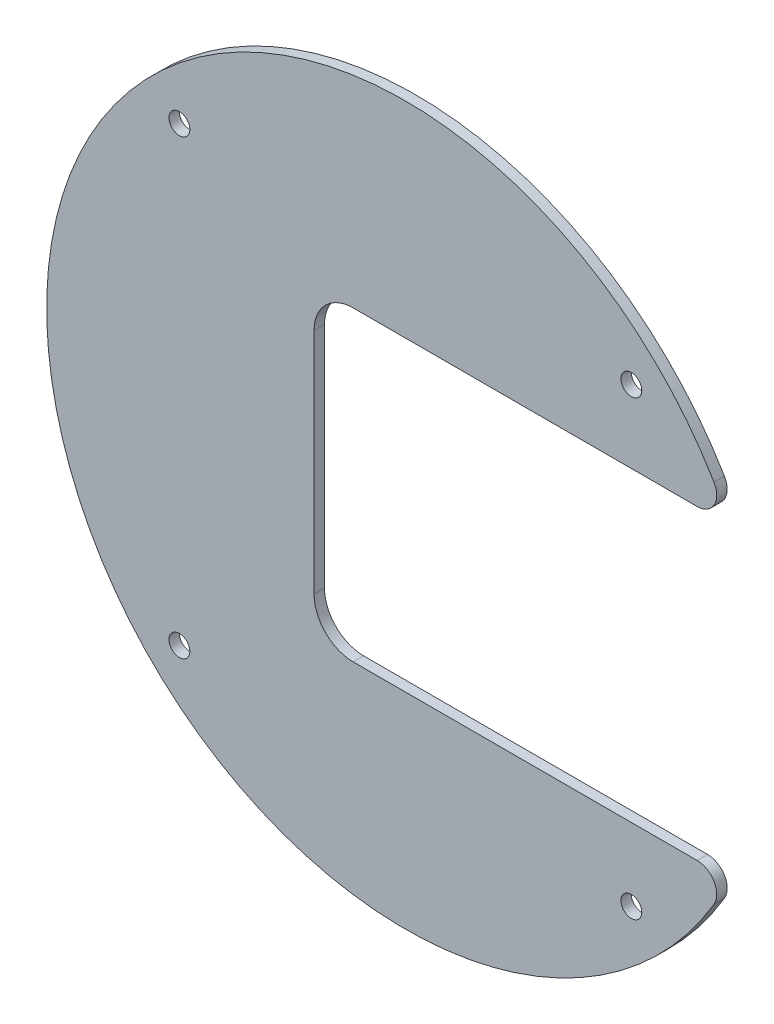
ISO-10303-21;
HEADER;
FILE_DESCRIPTION(('STEP AP214'),'2;1');
FILE_NAME('part.step','',(''),(''),'','','');
FILE_SCHEMA(('AUTOMOTIVE_DESIGN { 1 0 10303 214 1 1 1 1 }'));
ENDSEC;
DATA;
#1=APPLICATION_CONTEXT('core data for automotive mechanical design processes');
#2=APPLICATION_PROTOCOL_DEFINITION('international standard','automotive_design',2000,#1);
#3=PRODUCT_CONTEXT('',#1,'mechanical');
#4=PRODUCT('Part','Part','',(#3));
#5=PRODUCT_RELATED_PRODUCT_CATEGORY('part','',(#4));
#6=PRODUCT_DEFINITION_FORMATION('','',#4);
#7=PRODUCT_DEFINITION_CONTEXT('part definition',#1,'design');
#8=PRODUCT_DEFINITION('design','',#6,#7);
#9=PRODUCT_DEFINITION_SHAPE('','',#8);
#10=(LENGTH_UNIT() NAMED_UNIT(*) SI_UNIT(.MILLI.,.METRE.));
#11=(NAMED_UNIT(*) PLANE_ANGLE_UNIT() SI_UNIT($,.RADIAN.));
#12=(NAMED_UNIT(*) SI_UNIT($,.STERADIAN.) SOLID_ANGLE_UNIT());
#13=UNCERTAINTY_MEASURE_WITH_UNIT(LENGTH_MEASURE(1.E-05),#10,'distance_accuracy_value','');
#14=(GEOMETRIC_REPRESENTATION_CONTEXT(3) GLOBAL_UNCERTAINTY_ASSIGNED_CONTEXT((#13)) GLOBAL_UNIT_ASSIGNED_CONTEXT((#10,
#11,#12)) REPRESENTATION_CONTEXT('',''));
#15=CARTESIAN_POINT('',(0.,0.,0.));
#16=DIRECTION('',(0.,0.,1.));
#17=DIRECTION('',(1.,0.,0.));
#18=AXIS2_PLACEMENT_3D('',#15,#16,#17);
#19=CARTESIAN_POINT('',(0.,0.,1.6));
#20=DIRECTION('',(0.,0.,1.));
#21=DIRECTION('',(1.,0.,0.));
#22=AXIS2_PLACEMENT_3D('',#19,#20,#21);
#23=PLANE('',#22);
#24=CARTESIAN_POINT('',(-34.6482322781408,-34.6482322781408,1.6));
#25=DIRECTION('',(0.,0.,1.));
#26=DIRECTION('',(1.,0.,0.));
#27=AXIS2_PLACEMENT_3D('',#24,#25,#26);
#28=CIRCLE('',#27,1.6);
#29=CARTESIAN_POINT('',(-33.0482322781408,-34.6482322781408,1.6));
#30=VERTEX_POINT('',#29);
#31=EDGE_CURVE('E230',#30,#30,#28,.T.);
#32=ORIENTED_EDGE('',*,*,#31,.F.);
#33=EDGE_LOOP('',(#32));
#34=FACE_BOUND('',#33,.T.);
#35=CARTESIAN_POINT('',(34.6482322781408,34.6482322781408,1.6));
#36=DIRECTION('',(0.,0.,1.));
#37=DIRECTION('',(1.,0.,0.));
#38=AXIS2_PLACEMENT_3D('',#35,#36,#37);
#39=CIRCLE('',#38,1.6);
#40=CARTESIAN_POINT('',(36.2482322781408,34.6482322781408,1.6));
#41=VERTEX_POINT('',#40);
#42=EDGE_CURVE('E239',#41,#41,#39,.T.);
#43=ORIENTED_EDGE('',*,*,#42,.F.);
#44=EDGE_LOOP('',(#43));
#45=FACE_BOUND('',#44,.T.);
#46=DIRECTION('',(1.,0.,0.));
#47=VECTOR('',#46,1.);
#48=CARTESIAN_POINT('',(-14.,23.5,1.6));
#49=LINE('',#48,#47);
#50=CARTESIAN_POINT('',(-8.,23.5,1.6));
#51=VERTEX_POINT('',#50);
#52=CARTESIAN_POINT('',(44.7409208666965,23.5,1.6));
#53=VERTEX_POINT('',#52);
#54=EDGE_CURVE('E120',#51,#53,#49,.T.);
#55=ORIENTED_EDGE('',*,*,#54,.T.);
#56=CARTESIAN_POINT('',(44.7409208666965,26.5,1.6));
#57=DIRECTION('',(0.,0.,1.));
#58=DIRECTION('',(1.,0.,0.));
#59=AXIS2_PLACEMENT_3D('',#56,#57,#58);
#60=CIRCLE('',#59,3.);
#61=CARTESIAN_POINT('',(47.3221278397752,28.0288461538462,1.6));
#62=VERTEX_POINT('',#61);
#63=EDGE_CURVE('E45',#53,#62,#60,.T.);
#64=ORIENTED_EDGE('',*,*,#63,.T.);
#65=CARTESIAN_POINT('',(0.,0.,1.6));
#66=DIRECTION('',(0.,0.,1.));
#67=DIRECTION('',(1.,0.,0.));
#68=AXIS2_PLACEMENT_3D('',#65,#66,#67);
#69=CIRCLE('',#68,55.);
#70=CARTESIAN_POINT('',(47.3221278397752,-28.0288461538462,1.6));
#71=VERTEX_POINT('',#70);
#72=EDGE_CURVE('E127',#62,#71,#69,.T.);
#73=ORIENTED_EDGE('',*,*,#72,.T.);
#74=CARTESIAN_POINT('',(44.7409208666965,-26.5,1.6));
#75=DIRECTION('',(0.,0.,1.));
#76=DIRECTION('',(1.,0.,0.));
#77=AXIS2_PLACEMENT_3D('',#74,#75,#76);
#78=CIRCLE('',#77,3.);
#79=CARTESIAN_POINT('',(44.7409208666965,-23.5,1.6));
#80=VERTEX_POINT('',#79);
#81=EDGE_CURVE('E52',#71,#80,#78,.T.);
#82=ORIENTED_EDGE('',*,*,#81,.T.);
#83=DIRECTION('',(-1.,0.,0.));
#84=VECTOR('',#83,1.);
#85=CARTESIAN_POINT('',(49.7267533627523,-23.5,1.6));
#86=LINE('',#85,#84);
#87=CARTESIAN_POINT('',(-8.,-23.5,1.6));
#88=VERTEX_POINT('',#87);
#89=EDGE_CURVE('E130',#80,#88,#86,.T.);
#90=ORIENTED_EDGE('',*,*,#89,.T.);
#91=CARTESIAN_POINT('',(-8.,-17.5,1.6));
#92=DIRECTION('',(0.,0.,1.));
#93=DIRECTION('',(1.,0.,0.));
#94=AXIS2_PLACEMENT_3D('',#91,#92,#93);
#95=CIRCLE('',#94,6.);
#96=CARTESIAN_POINT('',(-14.,-17.5,1.6));
#97=VERTEX_POINT('',#96);
#98=EDGE_CURVE('E145',#88,#97,#95,.F.);
#99=ORIENTED_EDGE('',*,*,#98,.T.);
#100=DIRECTION('',(0.,1.,0.));
#101=VECTOR('',#100,1.);
#102=CARTESIAN_POINT('',(-14.,-23.5,1.6));
#103=LINE('',#102,#101);
#104=CARTESIAN_POINT('',(-14.,17.5,1.6));
#105=VERTEX_POINT('',#104);
#106=EDGE_CURVE('E246',#97,#105,#103,.T.);
#107=ORIENTED_EDGE('',*,*,#106,.T.);
#108=CARTESIAN_POINT('',(-8.,17.5,1.6));
#109=DIRECTION('',(0.,0.,1.));
#110=DIRECTION('',(1.,0.,0.));
#111=AXIS2_PLACEMENT_3D('',#108,#109,#110);
#112=CIRCLE('',#111,6.);
#113=EDGE_CURVE('E115',#105,#51,#112,.F.);
#114=ORIENTED_EDGE('',*,*,#113,.T.);
#115=EDGE_LOOP('',(#55,#64,#73,#82,#90,#99,#107,#114));
#116=FACE_BOUND('',#115,.T.);
#117=CARTESIAN_POINT('',(-34.6482322781408,34.6482322781408,1.6));
#118=DIRECTION('',(0.,0.,1.));
#119=DIRECTION('',(1.,0.,0.));
#120=AXIS2_PLACEMENT_3D('',#117,#118,#119);
#121=CIRCLE('',#120,1.6);
#122=CARTESIAN_POINT('',(-33.0482322781408,34.6482322781408,1.6));
#123=VERTEX_POINT('',#122);
#124=EDGE_CURVE('E225',#123,#123,#121,.T.);
#125=ORIENTED_EDGE('',*,*,#124,.F.);
#126=EDGE_LOOP('',(#125));
#127=FACE_BOUND('',#126,.T.);
#128=CARTESIAN_POINT('',(34.6482322781408,-34.6482322781408,1.6));
#129=DIRECTION('',(0.,0.,1.));
#130=DIRECTION('',(1.,0.,0.));
#131=AXIS2_PLACEMENT_3D('',#128,#129,#130);
#132=CIRCLE('',#131,1.6);
#133=CARTESIAN_POINT('',(36.2482322781408,-34.6482322781408,1.6));
#134=VERTEX_POINT('',#133);
#135=EDGE_CURVE('E265',#134,#134,#132,.T.);
#136=ORIENTED_EDGE('',*,*,#135,.F.);
#137=EDGE_LOOP('',(#136));
#138=FACE_BOUND('',#137,.T.);
#139=ADVANCED_FACE('F37',(#34,#45,#116,#127,#138),#23,.T.);
#140=CARTESIAN_POINT('',(0.,0.,0.));
#141=DIRECTION('',(0.,0.,1.));
#142=DIRECTION('',(1.,0.,0.));
#143=AXIS2_PLACEMENT_3D('',#140,#141,#142);
#144=PLANE('',#143);
#145=CARTESIAN_POINT('',(0.,0.,0.));
#146=DIRECTION('',(0.,0.,1.));
#147=DIRECTION('',(1.,0.,0.));
#148=AXIS2_PLACEMENT_3D('',#145,#146,#147);
#149=CIRCLE('',#148,55.);
#150=CARTESIAN_POINT('',(47.3221278397752,28.0288461538462,0.));
#151=VERTEX_POINT('',#150);
#152=CARTESIAN_POINT('',(47.3221278397752,-28.0288461538462,0.));
#153=VERTEX_POINT('',#152);
#154=EDGE_CURVE('E242',#151,#153,#149,.T.);
#155=ORIENTED_EDGE('',*,*,#154,.F.);
#156=CARTESIAN_POINT('',(44.7409208666965,26.5,0.));
#157=DIRECTION('',(0.,0.,1.));
#158=DIRECTION('',(1.,0.,0.));
#159=AXIS2_PLACEMENT_3D('',#156,#157,#158);
#160=CIRCLE('',#159,3.);
#161=CARTESIAN_POINT('',(44.7409208666965,23.5,0.));
#162=VERTEX_POINT('',#161);
#163=EDGE_CURVE('E126',#151,#162,#160,.F.);
#164=ORIENTED_EDGE('',*,*,#163,.T.);
#165=DIRECTION('',(1.,0.,0.));
#166=VECTOR('',#165,1.);
#167=CARTESIAN_POINT('',(-14.,23.5,0.));
#168=LINE('',#167,#166);
#169=CARTESIAN_POINT('',(-8.,23.5,0.));
#170=VERTEX_POINT('',#169);
#171=EDGE_CURVE('E119',#170,#162,#168,.T.);
#172=ORIENTED_EDGE('',*,*,#171,.F.);
#173=CARTESIAN_POINT('',(-8.,17.5,0.));
#174=DIRECTION('',(0.,0.,1.));
#175=DIRECTION('',(1.,0.,0.));
#176=AXIS2_PLACEMENT_3D('',#173,#174,#175);
#177=CIRCLE('',#176,6.);
#178=CARTESIAN_POINT('',(-14.,17.5,0.));
#179=VERTEX_POINT('',#178);
#180=EDGE_CURVE('E105',#170,#179,#177,.T.);
#181=ORIENTED_EDGE('',*,*,#180,.T.);
#182=DIRECTION('',(0.,1.,0.));
#183=VECTOR('',#182,1.);
#184=CARTESIAN_POINT('',(-14.,-23.5,0.));
#185=LINE('',#184,#183);
#186=CARTESIAN_POINT('',(-14.,-17.5,0.));
#187=VERTEX_POINT('',#186);
#188=EDGE_CURVE('E128',#187,#179,#185,.T.);
#189=ORIENTED_EDGE('',*,*,#188,.F.);
#190=CARTESIAN_POINT('',(-8.,-17.5,0.));
#191=DIRECTION('',(0.,0.,1.));
#192=DIRECTION('',(1.,0.,0.));
#193=AXIS2_PLACEMENT_3D('',#190,#191,#192);
#194=CIRCLE('',#193,6.);
#195=CARTESIAN_POINT('',(-8.,-23.5,0.));
#196=VERTEX_POINT('',#195);
#197=EDGE_CURVE('E142',#187,#196,#194,.T.);
#198=ORIENTED_EDGE('',*,*,#197,.T.);
#199=DIRECTION('',(-1.,0.,0.));
#200=VECTOR('',#199,1.);
#201=CARTESIAN_POINT('',(49.7267533627523,-23.5,0.));
#202=LINE('',#201,#200);
#203=CARTESIAN_POINT('',(44.7409208666965,-23.5,0.));
#204=VERTEX_POINT('',#203);
#205=EDGE_CURVE('E132',#204,#196,#202,.T.);
#206=ORIENTED_EDGE('',*,*,#205,.F.);
#207=CARTESIAN_POINT('',(44.7409208666965,-26.5,0.));
#208=DIRECTION('',(0.,0.,1.));
#209=DIRECTION('',(1.,0.,0.));
#210=AXIS2_PLACEMENT_3D('',#207,#208,#209);
#211=CIRCLE('',#210,3.);
#212=EDGE_CURVE('E152',#204,#153,#211,.F.);
#213=ORIENTED_EDGE('',*,*,#212,.T.);
#214=EDGE_LOOP('',(#155,#164,#172,#181,#189,#198,#206,#213));
#215=FACE_BOUND('',#214,.T.);
#216=CARTESIAN_POINT('',(34.6482322781408,34.6482322781408,0.));
#217=DIRECTION('',(0.,0.,1.));
#218=DIRECTION('',(1.,0.,0.));
#219=AXIS2_PLACEMENT_3D('',#216,#217,#218);
#220=CIRCLE('',#219,1.6);
#221=CARTESIAN_POINT('',(36.2482322781408,34.6482322781408,0.));
#222=VERTEX_POINT('',#221);
#223=EDGE_CURVE('E232',#222,#222,#220,.T.);
#224=ORIENTED_EDGE('',*,*,#223,.T.);
#225=EDGE_LOOP('',(#224));
#226=FACE_BOUND('',#225,.T.);
#227=CARTESIAN_POINT('',(-34.6482322781408,34.6482322781408,0.));
#228=DIRECTION('',(0.,0.,1.));
#229=DIRECTION('',(1.,0.,0.));
#230=AXIS2_PLACEMENT_3D('',#227,#228,#229);
#231=CIRCLE('',#230,1.6);
#232=CARTESIAN_POINT('',(-33.0482322781408,34.6482322781408,0.));
#233=VERTEX_POINT('',#232);
#234=EDGE_CURVE('E228',#233,#233,#231,.T.);
#235=ORIENTED_EDGE('',*,*,#234,.T.);
#236=EDGE_LOOP('',(#235));
#237=FACE_BOUND('',#236,.T.);
#238=CARTESIAN_POINT('',(-34.6482322781408,-34.6482322781408,0.));
#239=DIRECTION('',(0.,0.,1.));
#240=DIRECTION('',(1.,0.,0.));
#241=AXIS2_PLACEMENT_3D('',#238,#239,#240);
#242=CIRCLE('',#241,1.6);
#243=CARTESIAN_POINT('',(-33.0482322781408,-34.6482322781408,0.));
#244=VERTEX_POINT('',#243);
#245=EDGE_CURVE('E235',#244,#244,#242,.T.);
#246=ORIENTED_EDGE('',*,*,#245,.T.);
#247=EDGE_LOOP('',(#246));
#248=FACE_BOUND('',#247,.T.);
#249=CARTESIAN_POINT('',(34.6482322781408,-34.6482322781408,0.));
#250=DIRECTION('',(0.,0.,1.));
#251=DIRECTION('',(1.,0.,0.));
#252=AXIS2_PLACEMENT_3D('',#249,#250,#251);
#253=CIRCLE('',#252,1.6);
#254=CARTESIAN_POINT('',(36.2482322781408,-34.6482322781408,0.));
#255=VERTEX_POINT('',#254);
#256=EDGE_CURVE('E264',#255,#255,#253,.T.);
#257=ORIENTED_EDGE('',*,*,#256,.T.);
#258=EDGE_LOOP('',(#257));
#259=FACE_BOUND('',#258,.T.);
#260=ADVANCED_FACE('F124',(#215,#226,#237,#248,#259),#144,.F.);
#261=CARTESIAN_POINT('',(0.,0.,1.6));
#262=DIRECTION('',(0.,0.,-1.));
#263=DIRECTION('',(-1.,0.,0.));
#264=AXIS2_PLACEMENT_3D('',#261,#262,#263);
#265=CYLINDRICAL_SURFACE('',#264,55.);
#266=ORIENTED_EDGE('',*,*,#72,.F.);
#267=DIRECTION('',(0.,0.,-1.));
#268=VECTOR('',#267,1.);
#269=CARTESIAN_POINT('',(47.3221278397752,28.0288461538462,1.6));
#270=LINE('',#269,#268);
#271=EDGE_CURVE('E149',#62,#151,#270,.T.);
#272=ORIENTED_EDGE('',*,*,#271,.T.);
#273=ORIENTED_EDGE('',*,*,#154,.T.);
#274=DIRECTION('',(0.,0.,-1.));
#275=VECTOR('',#274,1.);
#276=CARTESIAN_POINT('',(47.3221278397752,-28.0288461538462,1.6));
#277=LINE('',#276,#275);
#278=EDGE_CURVE('E147',#153,#71,#277,.F.);
#279=ORIENTED_EDGE('',*,*,#278,.T.);
#280=EDGE_LOOP('',(#266,#272,#273,#279));
#281=FACE_BOUND('',#280,.T.);
#282=ADVANCED_FACE('F162',(#281),#265,.T.);
#283=CARTESIAN_POINT('',(49.7267533627523,-23.5,1.6));
#284=DIRECTION('',(0.,-1.,0.));
#285=DIRECTION('',(0.,0.,-1.));
#286=AXIS2_PLACEMENT_3D('',#283,#284,#285);
#287=PLANE('',#286);
#288=ORIENTED_EDGE('',*,*,#89,.F.);
#289=DIRECTION('',(0.,0.,-1.));
#290=VECTOR('',#289,1.);
#291=CARTESIAN_POINT('',(44.7409208666965,-23.5,1.6));
#292=LINE('',#291,#290);
#293=EDGE_CURVE('E11',#80,#204,#292,.T.);
#294=ORIENTED_EDGE('',*,*,#293,.T.);
#295=ORIENTED_EDGE('',*,*,#205,.T.);
#296=DIRECTION('',(0.,0.,-1.));
#297=VECTOR('',#296,1.);
#298=CARTESIAN_POINT('',(-8.,-23.5,1.6));
#299=LINE('',#298,#297);
#300=EDGE_CURVE('E116',#196,#88,#299,.F.);
#301=ORIENTED_EDGE('',*,*,#300,.T.);
#302=EDGE_LOOP('',(#288,#294,#295,#301));
#303=FACE_BOUND('',#302,.T.);
#304=ADVANCED_FACE('F193',(#303),#287,.F.);
#305=CARTESIAN_POINT('',(-14.,-23.5,1.6));
#306=DIRECTION('',(-1.,0.,0.));
#307=DIRECTION('',(0.,0.,1.));
#308=AXIS2_PLACEMENT_3D('',#305,#306,#307);
#309=PLANE('',#308);
#310=ORIENTED_EDGE('',*,*,#188,.T.);
#311=DIRECTION('',(0.,0.,-1.));
#312=VECTOR('',#311,1.);
#313=CARTESIAN_POINT('',(-14.,17.5,1.6));
#314=LINE('',#313,#312);
#315=EDGE_CURVE('E110',#179,#105,#314,.F.);
#316=ORIENTED_EDGE('',*,*,#315,.T.);
#317=ORIENTED_EDGE('',*,*,#106,.F.);
#318=DIRECTION('',(0.,0.,-1.));
#319=VECTOR('',#318,1.);
#320=CARTESIAN_POINT('',(-14.,-17.5,0.));
#321=LINE('',#320,#319);
#322=EDGE_CURVE('E121',#97,#187,#321,.T.);
#323=ORIENTED_EDGE('',*,*,#322,.T.);
#324=EDGE_LOOP('',(#310,#316,#317,#323));
#325=FACE_BOUND('',#324,.T.);
#326=ADVANCED_FACE('F190',(#325),#309,.F.);
#327=CARTESIAN_POINT('',(-14.,23.5,1.6));
#328=DIRECTION('',(0.,1.,0.));
#329=DIRECTION('',(0.,0.,1.));
#330=AXIS2_PLACEMENT_3D('',#327,#328,#329);
#331=PLANE('',#330);
#332=ORIENTED_EDGE('',*,*,#171,.T.);
#333=DIRECTION('',(0.,0.,-1.));
#334=VECTOR('',#333,1.);
#335=CARTESIAN_POINT('',(44.7409208666965,23.5,1.6));
#336=LINE('',#335,#334);
#337=EDGE_CURVE('E60',#162,#53,#336,.F.);
#338=ORIENTED_EDGE('',*,*,#337,.T.);
#339=ORIENTED_EDGE('',*,*,#54,.F.);
#340=DIRECTION('',(0.,0.,-1.));
#341=VECTOR('',#340,1.);
#342=CARTESIAN_POINT('',(-8.,23.5,0.));
#343=LINE('',#342,#341);
#344=EDGE_CURVE('E109',#51,#170,#343,.T.);
#345=ORIENTED_EDGE('',*,*,#344,.T.);
#346=EDGE_LOOP('',(#332,#338,#339,#345));
#347=FACE_BOUND('',#346,.T.);
#348=ADVANCED_FACE('F118',(#347),#331,.F.);
#349=CARTESIAN_POINT('',(34.6482322781408,34.6482322781408,1.6));
#350=DIRECTION('',(0.,0.,-1.));
#351=DIRECTION('',(-1.,0.,0.));
#352=AXIS2_PLACEMENT_3D('',#349,#350,#351);
#353=CYLINDRICAL_SURFACE('',#352,1.6);
#354=ORIENTED_EDGE('',*,*,#42,.T.);
#355=EDGE_LOOP('',(#354));
#356=FACE_BOUND('',#355,.T.);
#357=ORIENTED_EDGE('',*,*,#223,.F.);
#358=EDGE_LOOP('',(#357));
#359=FACE_BOUND('',#358,.T.);
#360=ADVANCED_FACE('F185',(#356,#359),#353,.F.);
#361=CARTESIAN_POINT('',(-34.6482322781408,34.6482322781408,1.6));
#362=DIRECTION('',(0.,0.,-1.));
#363=DIRECTION('',(-1.,0.,0.));
#364=AXIS2_PLACEMENT_3D('',#361,#362,#363);
#365=CYLINDRICAL_SURFACE('',#364,1.6);
#366=ORIENTED_EDGE('',*,*,#124,.T.);
#367=EDGE_LOOP('',(#366));
#368=FACE_BOUND('',#367,.T.);
#369=ORIENTED_EDGE('',*,*,#234,.F.);
#370=EDGE_LOOP('',(#369));
#371=FACE_BOUND('',#370,.T.);
#372=ADVANCED_FACE('F211',(#368,#371),#365,.F.);
#373=CARTESIAN_POINT('',(-34.6482322781408,-34.6482322781408,1.6));
#374=DIRECTION('',(0.,0.,-1.));
#375=DIRECTION('',(-1.,0.,0.));
#376=AXIS2_PLACEMENT_3D('',#373,#374,#375);
#377=CYLINDRICAL_SURFACE('',#376,1.6);
#378=ORIENTED_EDGE('',*,*,#31,.T.);
#379=EDGE_LOOP('',(#378));
#380=FACE_BOUND('',#379,.T.);
#381=ORIENTED_EDGE('',*,*,#245,.F.);
#382=EDGE_LOOP('',(#381));
#383=FACE_BOUND('',#382,.T.);
#384=ADVANCED_FACE('F205',(#380,#383),#377,.F.);
#385=CARTESIAN_POINT('',(34.6482322781408,-34.6482322781408,1.6));
#386=DIRECTION('',(0.,0.,-1.));
#387=DIRECTION('',(-1.,0.,0.));
#388=AXIS2_PLACEMENT_3D('',#385,#386,#387);
#389=CYLINDRICAL_SURFACE('',#388,1.6);
#390=ORIENTED_EDGE('',*,*,#135,.T.);
#391=EDGE_LOOP('',(#390));
#392=FACE_BOUND('',#391,.T.);
#393=ORIENTED_EDGE('',*,*,#256,.F.);
#394=EDGE_LOOP('',(#393));
#395=FACE_BOUND('',#394,.T.);
#396=ADVANCED_FACE('F201',(#392,#395),#389,.F.);
#397=CARTESIAN_POINT('',(-8.,17.5,1.6));
#398=DIRECTION('',(0.,0.,1.));
#399=DIRECTION('',(1.,0.,0.));
#400=AXIS2_PLACEMENT_3D('',#397,#398,#399);
#401=CYLINDRICAL_SURFACE('',#400,6.);
#402=ORIENTED_EDGE('',*,*,#113,.F.);
#403=ORIENTED_EDGE('',*,*,#315,.F.);
#404=ORIENTED_EDGE('',*,*,#180,.F.);
#405=ORIENTED_EDGE('',*,*,#344,.F.);
#406=EDGE_LOOP('',(#402,#403,#404,#405));
#407=FACE_BOUND('',#406,.T.);
#408=ADVANCED_FACE('F108',(#407),#401,.F.);
#409=CARTESIAN_POINT('',(-8.,-17.5,1.6));
#410=DIRECTION('',(0.,0.,1.));
#411=DIRECTION('',(1.,0.,0.));
#412=AXIS2_PLACEMENT_3D('',#409,#410,#411);
#413=CYLINDRICAL_SURFACE('',#412,6.);
#414=ORIENTED_EDGE('',*,*,#98,.F.);
#415=ORIENTED_EDGE('',*,*,#300,.F.);
#416=ORIENTED_EDGE('',*,*,#197,.F.);
#417=ORIENTED_EDGE('',*,*,#322,.F.);
#418=EDGE_LOOP('',(#414,#415,#416,#417));
#419=FACE_BOUND('',#418,.T.);
#420=ADVANCED_FACE('F167',(#419),#413,.F.);
#421=CARTESIAN_POINT('',(44.7409208666965,26.5,1.6));
#422=DIRECTION('',(0.,0.,-1.));
#423=DIRECTION('',(-1.,0.,0.));
#424=AXIS2_PLACEMENT_3D('',#421,#422,#423);
#425=CYLINDRICAL_SURFACE('',#424,3.);
#426=ORIENTED_EDGE('',*,*,#63,.F.);
#427=ORIENTED_EDGE('',*,*,#337,.F.);
#428=ORIENTED_EDGE('',*,*,#163,.F.);
#429=ORIENTED_EDGE('',*,*,#271,.F.);
#430=EDGE_LOOP('',(#426,#427,#428,#429));
#431=FACE_BOUND('',#430,.T.);
#432=ADVANCED_FACE('F165',(#431),#425,.T.);
#433=CARTESIAN_POINT('',(44.7409208666965,-26.5,1.6));
#434=DIRECTION('',(0.,0.,-1.));
#435=DIRECTION('',(-1.,0.,0.));
#436=AXIS2_PLACEMENT_3D('',#433,#434,#435);
#437=CYLINDRICAL_SURFACE('',#436,3.);
#438=ORIENTED_EDGE('',*,*,#81,.F.);
#439=ORIENTED_EDGE('',*,*,#278,.F.);
#440=ORIENTED_EDGE('',*,*,#212,.F.);
#441=ORIENTED_EDGE('',*,*,#293,.F.);
#442=EDGE_LOOP('',(#438,#439,#440,#441));
#443=FACE_BOUND('',#442,.T.);
#444=ADVANCED_FACE('F39',(#443),#437,.T.);
#445=CLOSED_SHELL('',(#139,#260,#282,#304,#326,#348,#360,#372,#384,#396,#408,#420,#432,#444));
#446=MANIFOLD_SOLID_BREP('B2',#445);
#447=ADVANCED_BREP_SHAPE_REPRESENTATION('',(#18,#446),#14);
#448=SHAPE_DEFINITION_REPRESENTATION(#9,#447);
ENDSEC;
END-ISO-10303-21;
